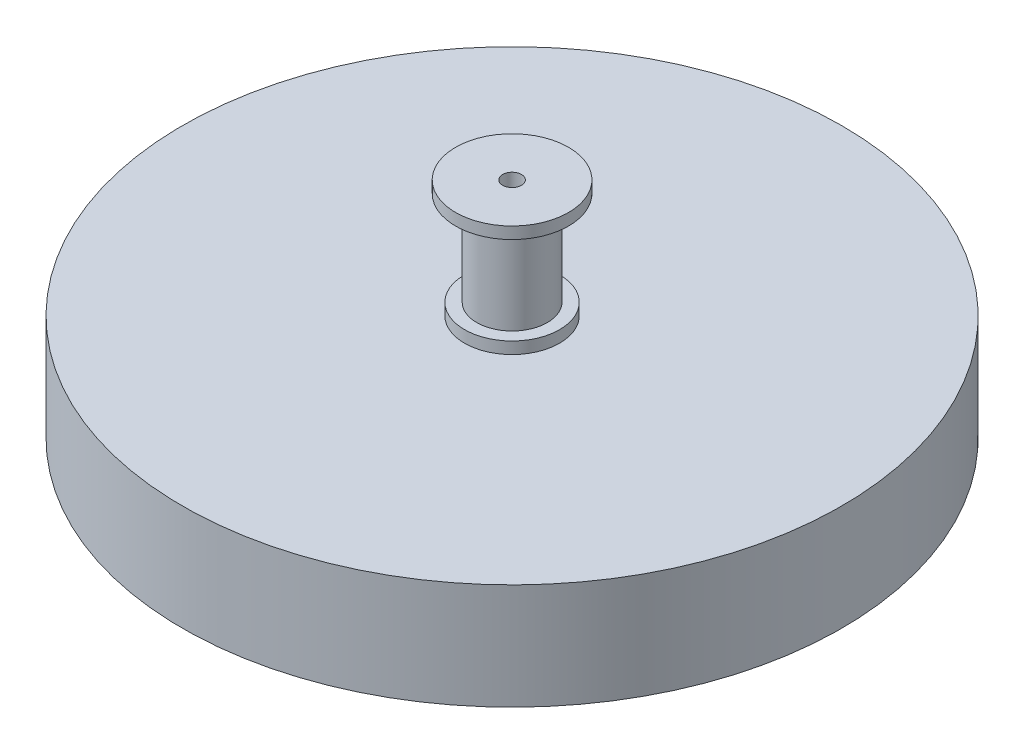
ISO-10303-21;
HEADER;
FILE_DESCRIPTION(('STEP AP214'),'2;1');
FILE_NAME('part.step','',(''),(''),'','','');
FILE_SCHEMA(('AUTOMOTIVE_DESIGN { 1 0 10303 214 1 1 1 1 }'));
ENDSEC;
DATA;
#1=APPLICATION_CONTEXT('core data for automotive mechanical design processes');
#2=APPLICATION_PROTOCOL_DEFINITION('international standard','automotive_design',2000,#1);
#3=PRODUCT_CONTEXT('',#1,'mechanical');
#4=PRODUCT('Part','Part','',(#3));
#5=PRODUCT_RELATED_PRODUCT_CATEGORY('part','',(#4));
#6=PRODUCT_DEFINITION_FORMATION('','',#4);
#7=PRODUCT_DEFINITION_CONTEXT('part definition',#1,'design');
#8=PRODUCT_DEFINITION('design','',#6,#7);
#9=PRODUCT_DEFINITION_SHAPE('','',#8);
#10=(LENGTH_UNIT() NAMED_UNIT(*) SI_UNIT(.MILLI.,.METRE.));
#11=(NAMED_UNIT(*) PLANE_ANGLE_UNIT() SI_UNIT($,.RADIAN.));
#12=(NAMED_UNIT(*) SI_UNIT($,.STERADIAN.) SOLID_ANGLE_UNIT());
#13=UNCERTAINTY_MEASURE_WITH_UNIT(LENGTH_MEASURE(1.E-05),#10,'distance_accuracy_value','');
#14=(GEOMETRIC_REPRESENTATION_CONTEXT(3) GLOBAL_UNCERTAINTY_ASSIGNED_CONTEXT((#13)) GLOBAL_UNIT_ASSIGNED_CONTEXT((#10,
#11,#12)) REPRESENTATION_CONTEXT('',''));
#15=CARTESIAN_POINT('',(0.,0.,0.));
#16=DIRECTION('',(0.,0.,1.));
#17=DIRECTION('',(1.,0.,0.));
#18=AXIS2_PLACEMENT_3D('',#15,#16,#17);
#19=CARTESIAN_POINT('',(0.,-27.5,14.9999999999997));
#20=DIRECTION('',(0.,1.,0.));
#21=DIRECTION('',(0.,0.,1.));
#22=AXIS2_PLACEMENT_3D('',#19,#20,#21);
#23=PLANE('',#22);
#24=CARTESIAN_POINT('',(0.,-27.5,0.));
#25=DIRECTION('',(0.,-1.,0.));
#26=DIRECTION('',(0.,0.,-1.));
#27=AXIS2_PLACEMENT_3D('',#24,#25,#26);
#28=CIRCLE('',#27,14.9999999999998);
#29=CARTESIAN_POINT('',(0.,-27.4999999999999,-14.9999999999999));
#30=VERTEX_POINT('',#29);
#31=EDGE_CURVE('E110',#30,#30,#28,.T.);
#32=ORIENTED_EDGE('',*,*,#31,.F.);
#33=EDGE_LOOP('',(#32));
#34=FACE_BOUND('',#33,.T.);
#35=CARTESIAN_POINT('',(0.,-27.4999999999999,0.));
#36=DIRECTION('',(0.,-1.,0.));
#37=DIRECTION('',(0.,0.,-1.));
#38=AXIS2_PLACEMENT_3D('',#35,#36,#37);
#39=CIRCLE('',#38,20.1904761879992);
#40=CARTESIAN_POINT('',(0.,-27.4999999999998,-20.1904761879993));
#41=VERTEX_POINT('',#40);
#42=EDGE_CURVE('E10',#41,#41,#39,.T.);
#43=ORIENTED_EDGE('',*,*,#42,.T.);
#44=EDGE_LOOP('',(#43));
#45=FACE_BOUND('',#44,.T.);
#46=ADVANCED_FACE('F39',(#34,#45),#23,.F.);
#47=CARTESIAN_POINT('',(0.,-1004.71260817899,-3.44641441837389E-12));
#48=DIRECTION('',(0.,-1.,0.));
#49=DIRECTION('',(0.,0.,-1.));
#50=AXIS2_PLACEMENT_3D('',#47,#48,#49);
#51=CYLINDRICAL_SURFACE('',#50,20.1904761879992);
#52=ORIENTED_EDGE('',*,*,#42,.F.);
#53=EDGE_LOOP('',(#52));
#54=FACE_BOUND('',#53,.T.);
#55=CARTESIAN_POINT('',(0.,-22.4999999999999,0.));
#56=DIRECTION('',(0.,-1.,0.));
#57=DIRECTION('',(0.,0.,-1.));
#58=AXIS2_PLACEMENT_3D('',#55,#56,#57);
#59=CIRCLE('',#58,20.1904761879992);
#60=CARTESIAN_POINT('',(0.,-22.4999999999998,-20.1904761879992));
#61=VERTEX_POINT('',#60);
#62=EDGE_CURVE('E46',#61,#61,#59,.T.);
#63=ORIENTED_EDGE('',*,*,#62,.T.);
#64=EDGE_LOOP('',(#63));
#65=FACE_BOUND('',#64,.T.);
#66=ADVANCED_FACE('F120',(#54,#65),#51,.T.);
#67=CARTESIAN_POINT('',(0.,-22.5000000000002,140.));
#68=DIRECTION('',(0.,1.,0.));
#69=DIRECTION('',(0.,0.,1.));
#70=AXIS2_PLACEMENT_3D('',#67,#68,#69);
#71=PLANE('',#70);
#72=ORIENTED_EDGE('',*,*,#62,.F.);
#73=EDGE_LOOP('',(#72));
#74=FACE_BOUND('',#73,.T.);
#75=CARTESIAN_POINT('',(0.,-22.4999999999995,0.));
#76=DIRECTION('',(0.,-1.,0.));
#77=DIRECTION('',(0.,0.,-1.));
#78=AXIS2_PLACEMENT_3D('',#75,#76,#77);
#79=CIRCLE('',#78,140.);
#80=CARTESIAN_POINT('',(0.,-22.499999999999,-140.));
#81=VERTEX_POINT('',#80);
#82=EDGE_CURVE('E54',#81,#81,#79,.T.);
#83=ORIENTED_EDGE('',*,*,#82,.T.);
#84=EDGE_LOOP('',(#83));
#85=FACE_BOUND('',#84,.T.);
#86=ADVANCED_FACE('F124',(#74,#85),#71,.F.);
#87=CARTESIAN_POINT('',(0.,-1004.71260817899,-3.44641441837389E-12));
#88=DIRECTION('',(0.,-1.,0.));
#89=DIRECTION('',(0.,0.,-1.));
#90=AXIS2_PLACEMENT_3D('',#87,#88,#89);
#91=CYLINDRICAL_SURFACE('',#90,140.);
#92=ORIENTED_EDGE('',*,*,#82,.F.);
#93=EDGE_LOOP('',(#92));
#94=FACE_BOUND('',#93,.T.);
#95=CARTESIAN_POINT('',(0.,22.5000000000004,0.));
#96=DIRECTION('',(0.,-1.,0.));
#97=DIRECTION('',(0.,0.,-1.));
#98=AXIS2_PLACEMENT_3D('',#95,#96,#97);
#99=CIRCLE('',#98,140.);
#100=CARTESIAN_POINT('',(0.,22.5000000000009,-140.));
#101=VERTEX_POINT('',#100);
#102=EDGE_CURVE('E62',#101,#101,#99,.T.);
#103=ORIENTED_EDGE('',*,*,#102,.T.);
#104=EDGE_LOOP('',(#103));
#105=FACE_BOUND('',#104,.T.);
#106=ADVANCED_FACE('F129',(#94,#105),#91,.T.);
#107=CARTESIAN_POINT('',(0.,22.5000000000002,20.1904761879991));
#108=DIRECTION('',(0.,-1.,0.));
#109=DIRECTION('',(0.,0.,-1.));
#110=AXIS2_PLACEMENT_3D('',#107,#108,#109);
#111=PLANE('',#110);
#112=ORIENTED_EDGE('',*,*,#102,.F.);
#113=EDGE_LOOP('',(#112));
#114=FACE_BOUND('',#113,.T.);
#115=CARTESIAN_POINT('',(0.,22.5,0.));
#116=DIRECTION('',(0.,-1.,0.));
#117=DIRECTION('',(0.,0.,-1.));
#118=AXIS2_PLACEMENT_3D('',#115,#116,#117);
#119=CIRCLE('',#118,20.190476187999);
#120=CARTESIAN_POINT('',(0.,22.5,-20.1904761879989));
#121=VERTEX_POINT('',#120);
#122=EDGE_CURVE('E68',#121,#121,#119,.T.);
#123=ORIENTED_EDGE('',*,*,#122,.T.);
#124=EDGE_LOOP('',(#123));
#125=FACE_BOUND('',#124,.T.);
#126=ADVANCED_FACE('F135',(#114,#125),#111,.F.);
#127=CARTESIAN_POINT('',(0.,-1004.71260817899,-3.44641441837389E-12));
#128=DIRECTION('',(0.,-1.,0.));
#129=DIRECTION('',(0.,0.,-1.));
#130=AXIS2_PLACEMENT_3D('',#127,#128,#129);
#131=CYLINDRICAL_SURFACE('',#130,20.190476187999);
#132=ORIENTED_EDGE('',*,*,#122,.F.);
#133=EDGE_LOOP('',(#132));
#134=FACE_BOUND('',#133,.T.);
#135=CARTESIAN_POINT('',(0.,27.5000000000001,0.));
#136=DIRECTION('',(0.,-1.,0.));
#137=DIRECTION('',(0.,0.,-1.));
#138=AXIS2_PLACEMENT_3D('',#135,#136,#137);
#139=CIRCLE('',#138,20.190476187999);
#140=CARTESIAN_POINT('',(0.,27.5000000000001,-20.1904761879989));
#141=VERTEX_POINT('',#140);
#142=EDGE_CURVE('E72',#141,#141,#139,.T.);
#143=ORIENTED_EDGE('',*,*,#142,.T.);
#144=EDGE_LOOP('',(#143));
#145=FACE_BOUND('',#144,.T.);
#146=ADVANCED_FACE('F139',(#134,#145),#131,.T.);
#147=CARTESIAN_POINT('',(0.,27.5,14.9999999999997));
#148=DIRECTION('',(0.,-1.,0.));
#149=DIRECTION('',(0.,0.,-1.));
#150=AXIS2_PLACEMENT_3D('',#147,#148,#149);
#151=PLANE('',#150);
#152=ORIENTED_EDGE('',*,*,#142,.F.);
#153=EDGE_LOOP('',(#152));
#154=FACE_BOUND('',#153,.T.);
#155=CARTESIAN_POINT('',(0.,27.5000000000001,0.));
#156=DIRECTION('',(0.,-1.,0.));
#157=DIRECTION('',(0.,0.,-1.));
#158=AXIS2_PLACEMENT_3D('',#155,#156,#157);
#159=CIRCLE('',#158,14.9999999999996);
#160=CARTESIAN_POINT('',(0.,27.5000000000001,-14.9999999999995));
#161=VERTEX_POINT('',#160);
#162=EDGE_CURVE('E76',#161,#161,#159,.T.);
#163=ORIENTED_EDGE('',*,*,#162,.T.);
#164=EDGE_LOOP('',(#163));
#165=FACE_BOUND('',#164,.T.);
#166=ADVANCED_FACE('F143',(#154,#165),#151,.F.);
#167=CARTESIAN_POINT('',(0.,-1004.71260817899,-3.44641441837389E-12));
#168=DIRECTION('',(0.,-1.,0.));
#169=DIRECTION('',(0.,0.,-1.));
#170=AXIS2_PLACEMENT_3D('',#167,#168,#169);
#171=CYLINDRICAL_SURFACE('',#170,14.9999999999996);
#172=ORIENTED_EDGE('',*,*,#162,.F.);
#173=EDGE_LOOP('',(#172));
#174=FACE_BOUND('',#173,.T.);
#175=CARTESIAN_POINT('',(0.,67.5000000000001,2.3154180742479E-13));
#176=DIRECTION('',(0.,-1.,0.));
#177=DIRECTION('',(0.,0.,-1.));
#178=AXIS2_PLACEMENT_3D('',#175,#176,#177);
#179=CIRCLE('',#178,14.9999999999995);
#180=CARTESIAN_POINT('',(0.,67.5000000000002,-14.9999999999993));
#181=VERTEX_POINT('',#180);
#182=EDGE_CURVE('E80',#181,#181,#179,.T.);
#183=ORIENTED_EDGE('',*,*,#182,.T.);
#184=EDGE_LOOP('',(#183));
#185=FACE_BOUND('',#184,.T.);
#186=ADVANCED_FACE('F147',(#174,#185),#171,.T.);
#187=CARTESIAN_POINT('',(0.,67.5,23.9999999999173));
#188=DIRECTION('',(0.,1.,0.));
#189=DIRECTION('',(0.,0.,1.));
#190=AXIS2_PLACEMENT_3D('',#187,#188,#189);
#191=PLANE('',#190);
#192=ORIENTED_EDGE('',*,*,#182,.F.);
#193=EDGE_LOOP('',(#192));
#194=FACE_BOUND('',#193,.T.);
#195=CARTESIAN_POINT('',(0.,67.5000000000001,2.3154180742479E-13));
#196=DIRECTION('',(0.,-1.,0.));
#197=DIRECTION('',(0.,0.,-1.));
#198=AXIS2_PLACEMENT_3D('',#195,#196,#197);
#199=CIRCLE('',#198,23.999999999917);
#200=CARTESIAN_POINT('',(0.,67.5000000000002,-23.9999999999168));
#201=VERTEX_POINT('',#200);
#202=EDGE_CURVE('E84',#201,#201,#199,.T.);
#203=ORIENTED_EDGE('',*,*,#202,.T.);
#204=EDGE_LOOP('',(#203));
#205=FACE_BOUND('',#204,.T.);
#206=ADVANCED_FACE('F151',(#194,#205),#191,.F.);
#207=CARTESIAN_POINT('',(0.,-1004.71260817899,-3.44641441837389E-12));
#208=DIRECTION('',(0.,-1.,0.));
#209=DIRECTION('',(0.,0.,-1.));
#210=AXIS2_PLACEMENT_3D('',#207,#208,#209);
#211=CYLINDRICAL_SURFACE('',#210,23.999999999917);
#212=ORIENTED_EDGE('',*,*,#202,.F.);
#213=EDGE_LOOP('',(#212));
#214=FACE_BOUND('',#213,.T.);
#215=CARTESIAN_POINT('',(0.,72.5,2.48693052419218E-13));
#216=DIRECTION('',(0.,-1.,0.));
#217=DIRECTION('',(0.,0.,-1.));
#218=AXIS2_PLACEMENT_3D('',#215,#216,#217);
#219=CIRCLE('',#218,23.999999999917);
#220=CARTESIAN_POINT('',(0.,72.5000000000001,-23.9999999999168));
#221=VERTEX_POINT('',#220);
#222=EDGE_CURVE('E88',#221,#221,#219,.T.);
#223=ORIENTED_EDGE('',*,*,#222,.T.);
#224=EDGE_LOOP('',(#223));
#225=FACE_BOUND('',#224,.T.);
#226=ADVANCED_FACE('F155',(#214,#225),#211,.T.);
#227=CARTESIAN_POINT('',(0.,72.5,23.9999999999173));
#228=DIRECTION('',(0.,-1.,0.));
#229=DIRECTION('',(0.,0.,-1.));
#230=AXIS2_PLACEMENT_3D('',#227,#228,#229);
#231=PLANE('',#230);
#232=ORIENTED_EDGE('',*,*,#222,.F.);
#233=EDGE_LOOP('',(#232));
#234=FACE_BOUND('',#233,.T.);
#235=CARTESIAN_POINT('',(0.,72.5,2.48693052419218E-13));
#236=DIRECTION('',(0.,-1.,0.));
#237=DIRECTION('',(0.,0.,-1.));
#238=AXIS2_PLACEMENT_3D('',#235,#236,#237);
#239=CIRCLE('',#238,3.99999999991703);
#240=CARTESIAN_POINT('',(0.,72.5,-3.99999999991678));
#241=VERTEX_POINT('',#240);
#242=EDGE_CURVE('E92',#241,#241,#239,.T.);
#243=ORIENTED_EDGE('',*,*,#242,.T.);
#244=EDGE_LOOP('',(#243));
#245=FACE_BOUND('',#244,.T.);
#246=ADVANCED_FACE('F159',(#234,#245),#231,.F.);
#247=CARTESIAN_POINT('',(0.,-1004.71260817899,-3.44641441837389E-12));
#248=DIRECTION('',(0.,-1.,0.));
#249=DIRECTION('',(0.,0.,-1.));
#250=AXIS2_PLACEMENT_3D('',#247,#248,#249);
#251=CYLINDRICAL_SURFACE('',#250,3.99999999991742);
#252=ORIENTED_EDGE('',*,*,#242,.F.);
#253=EDGE_LOOP('',(#252));
#254=FACE_BOUND('',#253,.T.);
#255=CARTESIAN_POINT('',(0.,-72.5,-2.48693052419217E-13));
#256=DIRECTION('',(0.,-1.,0.));
#257=DIRECTION('',(0.,0.,-1.));
#258=AXIS2_PLACEMENT_3D('',#255,#256,#257);
#259=CIRCLE('',#258,3.99999999991748);
#260=CARTESIAN_POINT('',(0.,-72.5,-3.99999999991773));
#261=VERTEX_POINT('',#260);
#262=EDGE_CURVE('E95',#261,#261,#259,.T.);
#263=ORIENTED_EDGE('',*,*,#262,.T.);
#264=EDGE_LOOP('',(#263));
#265=FACE_BOUND('',#264,.T.);
#266=ADVANCED_FACE('F163',(#254,#265),#251,.F.);
#267=CARTESIAN_POINT('',(0.,-72.5,23.9999999999173));
#268=DIRECTION('',(0.,1.,0.));
#269=DIRECTION('',(0.,0.,1.));
#270=AXIS2_PLACEMENT_3D('',#267,#268,#269);
#271=PLANE('',#270);
#272=ORIENTED_EDGE('',*,*,#262,.F.);
#273=EDGE_LOOP('',(#272));
#274=FACE_BOUND('',#273,.T.);
#275=CARTESIAN_POINT('',(0.,-72.4999999999999,-2.48693052419217E-13));
#276=DIRECTION('',(0.,-1.,0.));
#277=DIRECTION('',(0.,0.,-1.));
#278=AXIS2_PLACEMENT_3D('',#275,#276,#277);
#279=CIRCLE('',#278,23.9999999999175);
#280=CARTESIAN_POINT('',(0.,-72.4999999999998,-23.9999999999178));
#281=VERTEX_POINT('',#280);
#282=EDGE_CURVE('E98',#281,#281,#279,.T.);
#283=ORIENTED_EDGE('',*,*,#282,.T.);
#284=EDGE_LOOP('',(#283));
#285=FACE_BOUND('',#284,.T.);
#286=ADVANCED_FACE('F167',(#274,#285),#271,.F.);
#287=CARTESIAN_POINT('',(0.,-1004.71260817899,-3.44641441837389E-12));
#288=DIRECTION('',(0.,-1.,0.));
#289=DIRECTION('',(0.,0.,-1.));
#290=AXIS2_PLACEMENT_3D('',#287,#288,#289);
#291=CYLINDRICAL_SURFACE('',#290,23.9999999999175);
#292=ORIENTED_EDGE('',*,*,#282,.F.);
#293=EDGE_LOOP('',(#292));
#294=FACE_BOUND('',#293,.T.);
#295=CARTESIAN_POINT('',(0.,-67.4999999999999,-2.31541807424788E-13));
#296=DIRECTION('',(0.,-1.,0.));
#297=DIRECTION('',(0.,0.,-1.));
#298=AXIS2_PLACEMENT_3D('',#295,#296,#297);
#299=CIRCLE('',#298,23.9999999999175);
#300=CARTESIAN_POINT('',(0.,-67.4999999999998,-23.9999999999177));
#301=VERTEX_POINT('',#300);
#302=EDGE_CURVE('E102',#301,#301,#299,.T.);
#303=ORIENTED_EDGE('',*,*,#302,.T.);
#304=EDGE_LOOP('',(#303));
#305=FACE_BOUND('',#304,.T.);
#306=ADVANCED_FACE('F171',(#294,#305),#291,.T.);
#307=CARTESIAN_POINT('',(0.,-67.5,23.9999999999173));
#308=DIRECTION('',(0.,-1.,0.));
#309=DIRECTION('',(0.,0.,-1.));
#310=AXIS2_PLACEMENT_3D('',#307,#308,#309);
#311=PLANE('',#310);
#312=ORIENTED_EDGE('',*,*,#302,.F.);
#313=EDGE_LOOP('',(#312));
#314=FACE_BOUND('',#313,.T.);
#315=CARTESIAN_POINT('',(0.,-67.5,-2.31541807424789E-13));
#316=DIRECTION('',(0.,-1.,0.));
#317=DIRECTION('',(0.,0.,-1.));
#318=AXIS2_PLACEMENT_3D('',#315,#316,#317);
#319=CIRCLE('',#318,15.);
#320=CARTESIAN_POINT('',(0.,-67.4999999999999,-15.0000000000002));
#321=VERTEX_POINT('',#320);
#322=EDGE_CURVE('E106',#321,#321,#319,.T.);
#323=ORIENTED_EDGE('',*,*,#322,.T.);
#324=EDGE_LOOP('',(#323));
#325=FACE_BOUND('',#324,.T.);
#326=ADVANCED_FACE('F175',(#314,#325),#311,.F.);
#327=CARTESIAN_POINT('',(0.,-1004.71260817899,-3.44641441837389E-12));
#328=DIRECTION('',(0.,-1.,0.));
#329=DIRECTION('',(0.,0.,-1.));
#330=AXIS2_PLACEMENT_3D('',#327,#328,#329);
#331=CYLINDRICAL_SURFACE('',#330,14.9999999999999);
#332=ORIENTED_EDGE('',*,*,#322,.F.);
#333=EDGE_LOOP('',(#332));
#334=FACE_BOUND('',#333,.T.);
#335=ORIENTED_EDGE('',*,*,#31,.T.);
#336=EDGE_LOOP('',(#335));
#337=FACE_BOUND('',#336,.T.);
#338=ADVANCED_FACE('F117',(#334,#337),#331,.T.);
#339=CLOSED_SHELL('',(#46,#66,#86,#106,#126,#146,#166,#186,#206,#226,#246,#266,#286,#306,#326,#338));
#340=MANIFOLD_SOLID_BREP('B2',#339);
#341=ADVANCED_BREP_SHAPE_REPRESENTATION('',(#18,#340),#14);
#342=SHAPE_DEFINITION_REPRESENTATION(#9,#341);
ENDSEC;
END-ISO-10303-21;
